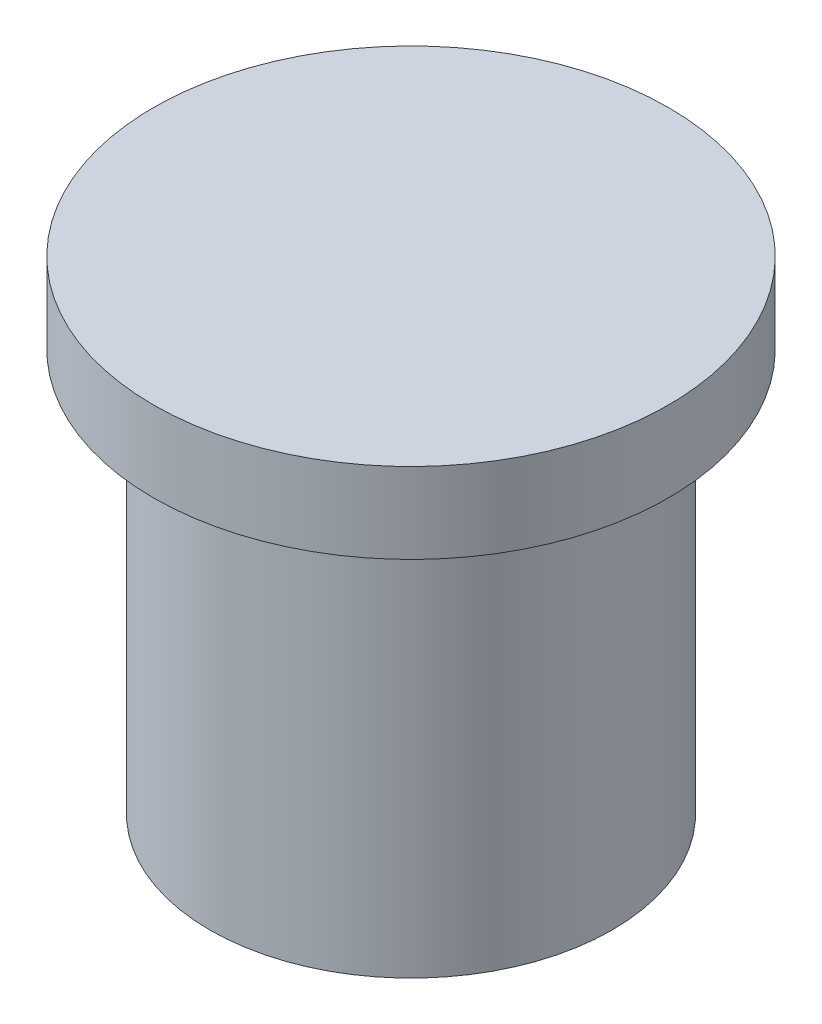
ISO-10303-21;
HEADER;
FILE_DESCRIPTION(('STEP AP214'),'2;1');
FILE_NAME('part.step','',(''),(''),'','','');
FILE_SCHEMA(('AUTOMOTIVE_DESIGN { 1 0 10303 214 1 1 1 1 }'));
ENDSEC;
DATA;
#1=APPLICATION_CONTEXT('core data for automotive mechanical design processes');
#2=APPLICATION_PROTOCOL_DEFINITION('international standard','automotive_design',2000,#1);
#3=PRODUCT_CONTEXT('',#1,'mechanical');
#4=PRODUCT('Part','Part','',(#3));
#5=PRODUCT_RELATED_PRODUCT_CATEGORY('part','',(#4));
#6=PRODUCT_DEFINITION_FORMATION('','',#4);
#7=PRODUCT_DEFINITION_CONTEXT('part definition',#1,'design');
#8=PRODUCT_DEFINITION('design','',#6,#7);
#9=PRODUCT_DEFINITION_SHAPE('','',#8);
#10=(LENGTH_UNIT() NAMED_UNIT(*) SI_UNIT(.MILLI.,.METRE.));
#11=(NAMED_UNIT(*) PLANE_ANGLE_UNIT() SI_UNIT($,.RADIAN.));
#12=(NAMED_UNIT(*) SI_UNIT($,.STERADIAN.) SOLID_ANGLE_UNIT());
#13=UNCERTAINTY_MEASURE_WITH_UNIT(LENGTH_MEASURE(1.E-05),#10,'distance_accuracy_value','');
#14=(GEOMETRIC_REPRESENTATION_CONTEXT(3) GLOBAL_UNCERTAINTY_ASSIGNED_CONTEXT((#13)) GLOBAL_UNIT_ASSIGNED_CONTEXT((#10,
#11,#12)) REPRESENTATION_CONTEXT('',''));
#15=CARTESIAN_POINT('',(0.,0.,0.));
#16=DIRECTION('',(0.,0.,1.));
#17=DIRECTION('',(1.,0.,0.));
#18=AXIS2_PLACEMENT_3D('',#15,#16,#17);
#19=CARTESIAN_POINT('',(0.,5.,0.));
#20=DIRECTION('',(0.,-1.,0.));
#21=DIRECTION('',(0.,0.,-1.));
#22=AXIS2_PLACEMENT_3D('',#19,#20,#21);
#23=CYLINDRICAL_SURFACE('',#22,2.5);
#24=CARTESIAN_POINT('',(0.,5.,0.));
#25=DIRECTION('',(0.,1.,0.));
#26=DIRECTION('',(0.,0.,1.));
#27=AXIS2_PLACEMENT_3D('',#24,#25,#26);
#28=CIRCLE('',#27,2.5);
#29=CARTESIAN_POINT('',(0.,5.,2.5));
#30=VERTEX_POINT('',#29);
#31=EDGE_CURVE('E10',#30,#30,#28,.T.);
#32=ORIENTED_EDGE('',*,*,#31,.F.);
#33=EDGE_LOOP('',(#32));
#34=FACE_BOUND('',#33,.T.);
#35=CARTESIAN_POINT('',(0.,0.,0.));
#36=DIRECTION('',(0.,1.,0.));
#37=DIRECTION('',(0.,0.,1.));
#38=AXIS2_PLACEMENT_3D('',#35,#36,#37);
#39=CIRCLE('',#38,2.5);
#40=CARTESIAN_POINT('',(0.,0.,2.5));
#41=VERTEX_POINT('',#40);
#42=EDGE_CURVE('E36',#41,#41,#39,.T.);
#43=ORIENTED_EDGE('',*,*,#42,.T.);
#44=EDGE_LOOP('',(#43));
#45=FACE_BOUND('',#44,.T.);
#46=ADVANCED_FACE('F33',(#34,#45),#23,.T.);
#47=CARTESIAN_POINT('',(0.,0.,0.));
#48=DIRECTION('',(0.,1.,0.));
#49=DIRECTION('',(0.,0.,1.));
#50=AXIS2_PLACEMENT_3D('',#47,#48,#49);
#51=PLANE('',#50);
#52=ORIENTED_EDGE('',*,*,#42,.F.);
#53=EDGE_LOOP('',(#52));
#54=FACE_BOUND('',#53,.T.);
#55=ADVANCED_FACE('F61',(#54),#51,.F.);
#56=CARTESIAN_POINT('',(0.,5.,0.));
#57=DIRECTION('',(0.,1.,0.));
#58=DIRECTION('',(0.,0.,1.));
#59=AXIS2_PLACEMENT_3D('',#56,#57,#58);
#60=PLANE('',#59);
#61=CARTESIAN_POINT('',(0.,5.,0.));
#62=DIRECTION('',(0.,1.,0.));
#63=DIRECTION('',(0.,0.,1.));
#64=AXIS2_PLACEMENT_3D('',#61,#62,#63);
#65=CIRCLE('',#64,3.2);
#66=CARTESIAN_POINT('',(0.,5.,3.2));
#67=VERTEX_POINT('',#66);
#68=EDGE_CURVE('E45',#67,#67,#65,.T.);
#69=ORIENTED_EDGE('',*,*,#68,.F.);
#70=EDGE_LOOP('',(#69));
#71=FACE_BOUND('',#70,.T.);
#72=ORIENTED_EDGE('',*,*,#31,.T.);
#73=EDGE_LOOP('',(#72));
#74=FACE_BOUND('',#73,.T.);
#75=ADVANCED_FACE('F56',(#71,#74),#60,.F.);
#76=CARTESIAN_POINT('',(0.,6.,0.));
#77=DIRECTION('',(0.,-1.,0.));
#78=DIRECTION('',(0.,0.,-1.));
#79=AXIS2_PLACEMENT_3D('',#76,#77,#78);
#80=CYLINDRICAL_SURFACE('',#79,3.2);
#81=CARTESIAN_POINT('',(0.,6.,0.));
#82=DIRECTION('',(0.,1.,0.));
#83=DIRECTION('',(0.,0.,1.));
#84=AXIS2_PLACEMENT_3D('',#81,#82,#83);
#85=CIRCLE('',#84,3.2);
#86=CARTESIAN_POINT('',(0.,6.,3.2));
#87=VERTEX_POINT('',#86);
#88=EDGE_CURVE('E43',#87,#87,#85,.T.);
#89=ORIENTED_EDGE('',*,*,#88,.F.);
#90=EDGE_LOOP('',(#89));
#91=FACE_BOUND('',#90,.T.);
#92=ORIENTED_EDGE('',*,*,#68,.T.);
#93=EDGE_LOOP('',(#92));
#94=FACE_BOUND('',#93,.T.);
#95=ADVANCED_FACE('F53',(#91,#94),#80,.T.);
#96=CARTESIAN_POINT('',(0.,6.,0.));
#97=DIRECTION('',(0.,1.,0.));
#98=DIRECTION('',(0.,0.,1.));
#99=AXIS2_PLACEMENT_3D('',#96,#97,#98);
#100=PLANE('',#99);
#101=ORIENTED_EDGE('',*,*,#88,.T.);
#102=EDGE_LOOP('',(#101));
#103=FACE_BOUND('',#102,.T.);
#104=ADVANCED_FACE('F51',(#103),#100,.T.);
#105=CLOSED_SHELL('',(#46,#55,#75,#95,#104));
#106=MANIFOLD_SOLID_BREP('B2',#105);
#107=ADVANCED_BREP_SHAPE_REPRESENTATION('',(#18,#106),#14);
#108=SHAPE_DEFINITION_REPRESENTATION(#9,#107);
ENDSEC;
END-ISO-10303-21;
